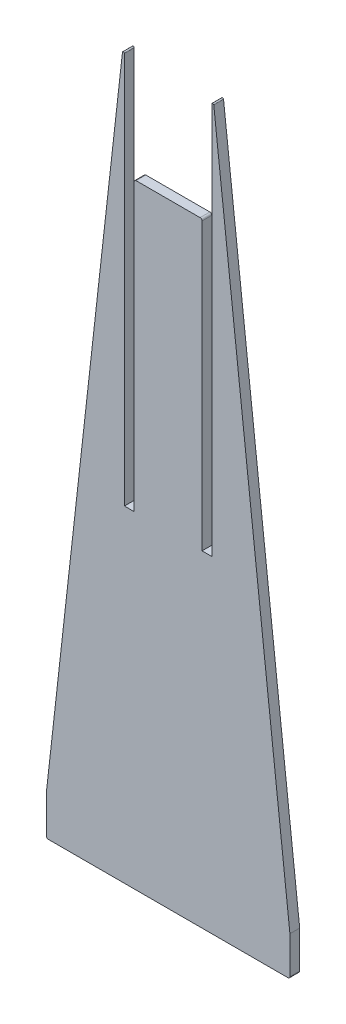
ISO-10303-21;
HEADER;
FILE_DESCRIPTION(('STEP AP214'),'2;1');
FILE_NAME('part.step','',(''),(''),'','','');
FILE_SCHEMA(('AUTOMOTIVE_DESIGN { 1 0 10303 214 1 1 1 1 }'));
ENDSEC;
DATA;
#1=APPLICATION_CONTEXT('core data for automotive mechanical design processes');
#2=APPLICATION_PROTOCOL_DEFINITION('international standard','automotive_design',2000,#1);
#3=PRODUCT_CONTEXT('',#1,'mechanical');
#4=PRODUCT('Part','Part','',(#3));
#5=PRODUCT_RELATED_PRODUCT_CATEGORY('part','',(#4));
#6=PRODUCT_DEFINITION_FORMATION('','',#4);
#7=PRODUCT_DEFINITION_CONTEXT('part definition',#1,'design');
#8=PRODUCT_DEFINITION('design','',#6,#7);
#9=PRODUCT_DEFINITION_SHAPE('','',#8);
#10=(LENGTH_UNIT() NAMED_UNIT(*) SI_UNIT(.MILLI.,.METRE.));
#11=(NAMED_UNIT(*) PLANE_ANGLE_UNIT() SI_UNIT($,.RADIAN.));
#12=(NAMED_UNIT(*) SI_UNIT($,.STERADIAN.) SOLID_ANGLE_UNIT());
#13=UNCERTAINTY_MEASURE_WITH_UNIT(LENGTH_MEASURE(1.E-05),#10,'distance_accuracy_value','');
#14=(GEOMETRIC_REPRESENTATION_CONTEXT(3) GLOBAL_UNCERTAINTY_ASSIGNED_CONTEXT((#13)) GLOBAL_UNIT_ASSIGNED_CONTEXT((#10,
#11,#12)) REPRESENTATION_CONTEXT('',''));
#15=CARTESIAN_POINT('',(0.,0.,0.));
#16=DIRECTION('',(0.,0.,1.));
#17=DIRECTION('',(1.,0.,0.));
#18=AXIS2_PLACEMENT_3D('',#15,#16,#17);
#19=CARTESIAN_POINT('',(-22.35,376.5,2.5));
#20=DIRECTION('',(-1.,0.,0.));
#21=DIRECTION('',(0.,-1.,0.));
#22=AXIS2_PLACEMENT_3D('',#19,#20,#21);
#23=PLANE('',#22);
#24=DIRECTION('',(0.,1.,0.));
#25=VECTOR('',#24,1.);
#26=CARTESIAN_POINT('',(-22.35,376.5,-2.5));
#27=LINE('',#26,#25);
#28=CARTESIAN_POINT('',(-22.35,167.1,-2.5));
#29=VERTEX_POINT('',#28);
#30=CARTESIAN_POINT('',(-22.35,367.54841740929,-2.5));
#31=VERTEX_POINT('',#30);
#32=EDGE_CURVE('E210',#29,#31,#27,.T.);
#33=ORIENTED_EDGE('',*,*,#32,.T.);
#34=DIRECTION('',(0.,0.,-1.));
#35=VECTOR('',#34,1.);
#36=CARTESIAN_POINT('',(-22.35,367.54841740929,2.5));
#37=LINE('',#36,#35);
#38=CARTESIAN_POINT('',(-22.35,367.54841740929,2.5));
#39=VERTEX_POINT('',#38);
#40=EDGE_CURVE('E290',#31,#39,#37,.F.);
#41=ORIENTED_EDGE('',*,*,#40,.T.);
#42=DIRECTION('',(0.,1.,0.));
#43=VECTOR('',#42,1.);
#44=CARTESIAN_POINT('',(-22.35,376.5,2.5));
#45=LINE('',#44,#43);
#46=CARTESIAN_POINT('',(-22.35,167.1,2.5));
#47=VERTEX_POINT('',#46);
#48=EDGE_CURVE('E169',#47,#39,#45,.T.);
#49=ORIENTED_EDGE('',*,*,#48,.F.);
#50=DIRECTION('',(0.,0.,-1.));
#51=VECTOR('',#50,1.);
#52=CARTESIAN_POINT('',(-22.35,167.1,2.5));
#53=LINE('',#52,#51);
#54=EDGE_CURVE('E209',#47,#29,#53,.T.);
#55=ORIENTED_EDGE('',*,*,#54,.T.);
#56=EDGE_LOOP('',(#33,#41,#49,#55));
#57=FACE_BOUND('',#56,.T.);
#58=ADVANCED_FACE('F33',(#57),#23,.F.);
#59=CARTESIAN_POINT('',(-22.35,376.5,2.5));
#60=DIRECTION('',(0.993779611450434,-0.111364643695497,0.));
#61=DIRECTION('',(0.111364643695497,0.993779611450434,0.));
#62=AXIS2_PLACEMENT_3D('',#59,#60,#61);
#63=PLANE('',#62);
#64=DIRECTION('',(-0.111364643695497,-0.993779611450434,0.));
#65=VECTOR('',#64,1.);
#66=CARTESIAN_POINT('',(-22.35,376.5,2.5));
#67=LINE('',#66,#65);
#68=CARTESIAN_POINT('',(-23.3468898057252,367.604099731138,2.5));
#69=VERTEX_POINT('',#68);
#70=CARTESIAN_POINT('',(-62.3,20.,2.5));
#71=VERTEX_POINT('',#70);
#72=EDGE_CURVE('E157',#69,#71,#67,.T.);
#73=ORIENTED_EDGE('',*,*,#72,.F.);
#74=DIRECTION('',(0.,0.,-1.));
#75=VECTOR('',#74,1.);
#76=CARTESIAN_POINT('',(-23.3468898057252,367.604099731138,2.5));
#77=LINE('',#76,#75);
#78=CARTESIAN_POINT('',(-23.3468898057252,367.604099731138,-2.5));
#79=VERTEX_POINT('',#78);
#80=EDGE_CURVE('E284',#69,#79,#77,.T.);
#81=ORIENTED_EDGE('',*,*,#80,.T.);
#82=DIRECTION('',(-0.111364643695497,-0.993779611450434,0.));
#83=VECTOR('',#82,1.);
#84=CARTESIAN_POINT('',(-22.35,376.5,-2.5));
#85=LINE('',#84,#83);
#86=CARTESIAN_POINT('',(-62.3,20.,-2.5));
#87=VERTEX_POINT('',#86);
#88=EDGE_CURVE('E175',#79,#87,#85,.T.);
#89=ORIENTED_EDGE('',*,*,#88,.T.);
#90=DIRECTION('',(0.,0.,-1.));
#91=VECTOR('',#90,1.);
#92=CARTESIAN_POINT('',(-62.3,20.,2.5));
#93=LINE('',#92,#91);
#94=EDGE_CURVE('E172',#71,#87,#93,.T.);
#95=ORIENTED_EDGE('',*,*,#94,.F.);
#96=EDGE_LOOP('',(#73,#81,#89,#95));
#97=FACE_BOUND('',#96,.T.);
#98=ADVANCED_FACE('F173',(#97),#63,.F.);
#99=CARTESIAN_POINT('',(-62.3,20.,2.5));
#100=DIRECTION('',(1.,0.,0.));
#101=DIRECTION('',(0.,0.,-1.));
#102=AXIS2_PLACEMENT_3D('',#99,#100,#101);
#103=PLANE('',#102);
#104=DIRECTION('',(0.,-1.,0.));
#105=VECTOR('',#104,1.);
#106=CARTESIAN_POINT('',(-62.3,20.,-2.5));
#107=LINE('',#106,#105);
#108=CARTESIAN_POINT('',(-62.3,0.999999999999984,-2.5));
#109=VERTEX_POINT('',#108);
#110=EDGE_CURVE('E214',#87,#109,#107,.T.);
#111=ORIENTED_EDGE('',*,*,#110,.T.);
#112=DIRECTION('',(0.,0.,-1.));
#113=VECTOR('',#112,1.);
#114=CARTESIAN_POINT('',(-62.3,0.999999999999984,2.5));
#115=LINE('',#114,#113);
#116=CARTESIAN_POINT('',(-62.3,0.999999999999984,2.5));
#117=VERTEX_POINT('',#116);
#118=EDGE_CURVE('E184',#109,#117,#115,.F.);
#119=ORIENTED_EDGE('',*,*,#118,.T.);
#120=DIRECTION('',(0.,-1.,0.));
#121=VECTOR('',#120,1.);
#122=CARTESIAN_POINT('',(-62.3,20.,2.5));
#123=LINE('',#122,#121);
#124=EDGE_CURVE('E162',#71,#117,#123,.T.);
#125=ORIENTED_EDGE('',*,*,#124,.F.);
#126=ORIENTED_EDGE('',*,*,#94,.T.);
#127=EDGE_LOOP('',(#111,#119,#125,#126));
#128=FACE_BOUND('',#127,.T.);
#129=ADVANCED_FACE('F182',(#128),#103,.F.);
#130=CARTESIAN_POINT('',(-62.3,0.,2.5));
#131=DIRECTION('',(0.,1.,0.));
#132=DIRECTION('',(-1.,0.,0.));
#133=AXIS2_PLACEMENT_3D('',#130,#131,#132);
#134=PLANE('',#133);
#135=DIRECTION('',(1.,0.,0.));
#136=VECTOR('',#135,1.);
#137=CARTESIAN_POINT('',(-62.3,0.,2.5));
#138=LINE('',#137,#136);
#139=CARTESIAN_POINT('',(-61.3,0.,2.5));
#140=VERTEX_POINT('',#139);
#141=CARTESIAN_POINT('',(61.3000000000001,0.,2.5));
#142=VERTEX_POINT('',#141);
#143=EDGE_CURVE('E185',#140,#142,#138,.T.);
#144=ORIENTED_EDGE('',*,*,#143,.F.);
#145=DIRECTION('',(0.,0.,-1.));
#146=VECTOR('',#145,1.);
#147=CARTESIAN_POINT('',(-61.3,0.,2.5));
#148=LINE('',#147,#146);
#149=CARTESIAN_POINT('',(-61.3,0.,-2.5));
#150=VERTEX_POINT('',#149);
#151=EDGE_CURVE('E251',#140,#150,#148,.T.);
#152=ORIENTED_EDGE('',*,*,#151,.T.);
#153=DIRECTION('',(1.,0.,0.));
#154=VECTOR('',#153,1.);
#155=CARTESIAN_POINT('',(-62.3,0.,-2.5));
#156=LINE('',#155,#154);
#157=CARTESIAN_POINT('',(61.3000000000001,0.,-2.5));
#158=VERTEX_POINT('',#157);
#159=EDGE_CURVE('E216',#150,#158,#156,.T.);
#160=ORIENTED_EDGE('',*,*,#159,.T.);
#161=DIRECTION('',(0.,0.,-1.));
#162=VECTOR('',#161,1.);
#163=CARTESIAN_POINT('',(61.3000000000001,0.,2.5));
#164=LINE('',#163,#162);
#165=EDGE_CURVE('E179',#158,#142,#164,.F.);
#166=ORIENTED_EDGE('',*,*,#165,.T.);
#167=EDGE_LOOP('',(#144,#152,#160,#166));
#168=FACE_BOUND('',#167,.T.);
#169=ADVANCED_FACE('F349',(#168),#134,.F.);
#170=CARTESIAN_POINT('',(62.3000000000001,20.,2.5));
#171=DIRECTION('',(-1.,0.,0.));
#172=DIRECTION('',(0.,-1.,0.));
#173=AXIS2_PLACEMENT_3D('',#170,#171,#172);
#174=PLANE('',#173);
#175=DIRECTION('',(0.,1.,0.));
#176=VECTOR('',#175,1.);
#177=CARTESIAN_POINT('',(62.3000000000001,20.,2.5));
#178=LINE('',#177,#176);
#179=CARTESIAN_POINT('',(62.3000000000001,0.999999999999997,2.5));
#180=VERTEX_POINT('',#179);
#181=CARTESIAN_POINT('',(62.3000000000001,20.,2.5));
#182=VERTEX_POINT('',#181);
#183=EDGE_CURVE('E188',#180,#182,#178,.T.);
#184=ORIENTED_EDGE('',*,*,#183,.F.);
#185=DIRECTION('',(0.,0.,-1.));
#186=VECTOR('',#185,1.);
#187=CARTESIAN_POINT('',(62.3000000000001,0.999999999999997,2.5));
#188=LINE('',#187,#186);
#189=CARTESIAN_POINT('',(62.3000000000001,0.999999999999997,-2.5));
#190=VERTEX_POINT('',#189);
#191=EDGE_CURVE('E271',#180,#190,#188,.T.);
#192=ORIENTED_EDGE('',*,*,#191,.T.);
#193=DIRECTION('',(0.,1.,0.));
#194=VECTOR('',#193,1.);
#195=CARTESIAN_POINT('',(62.3000000000001,20.,-2.5));
#196=LINE('',#195,#194);
#197=CARTESIAN_POINT('',(62.3000000000001,20.,-2.5));
#198=VERTEX_POINT('',#197);
#199=EDGE_CURVE('E219',#190,#198,#196,.T.);
#200=ORIENTED_EDGE('',*,*,#199,.T.);
#201=DIRECTION('',(0.,0.,-1.));
#202=VECTOR('',#201,1.);
#203=CARTESIAN_POINT('',(62.3000000000001,20.,2.5));
#204=LINE('',#203,#202);
#205=EDGE_CURVE('E180',#182,#198,#204,.T.);
#206=ORIENTED_EDGE('',*,*,#205,.F.);
#207=EDGE_LOOP('',(#184,#192,#200,#206));
#208=FACE_BOUND('',#207,.T.);
#209=ADVANCED_FACE('F357',(#208),#174,.F.);
#210=CARTESIAN_POINT('',(22.35,376.5,2.5));
#211=DIRECTION('',(-0.993779611450434,-0.111364643695498,0.));
#212=DIRECTION('',(0.111364643695498,-0.993779611450434,0.));
#213=AXIS2_PLACEMENT_3D('',#210,#211,#212);
#214=PLANE('',#213);
#215=DIRECTION('',(-0.111364643695498,0.993779611450434,0.));
#216=VECTOR('',#215,1.);
#217=CARTESIAN_POINT('',(22.35,376.5,-2.5));
#218=LINE('',#217,#216);
#219=CARTESIAN_POINT('',(23.3468898057252,367.604099731138,-2.5));
#220=VERTEX_POINT('',#219);
#221=EDGE_CURVE('E221',#198,#220,#218,.T.);
#222=ORIENTED_EDGE('',*,*,#221,.T.);
#223=DIRECTION('',(0.,0.,-1.));
#224=VECTOR('',#223,1.);
#225=CARTESIAN_POINT('',(23.3468898057252,367.604099731138,2.5));
#226=LINE('',#225,#224);
#227=CARTESIAN_POINT('',(23.3468898057252,367.604099731138,2.5));
#228=VERTEX_POINT('',#227);
#229=EDGE_CURVE('E11',#220,#228,#226,.F.);
#230=ORIENTED_EDGE('',*,*,#229,.T.);
#231=DIRECTION('',(-0.111364643695498,0.993779611450434,0.));
#232=VECTOR('',#231,1.);
#233=CARTESIAN_POINT('',(22.35,376.5,2.5));
#234=LINE('',#233,#232);
#235=EDGE_CURVE('E193',#182,#228,#234,.T.);
#236=ORIENTED_EDGE('',*,*,#235,.F.);
#237=ORIENTED_EDGE('',*,*,#205,.T.);
#238=EDGE_LOOP('',(#222,#230,#236,#237));
#239=FACE_BOUND('',#238,.T.);
#240=ADVANCED_FACE('F359',(#239),#214,.F.);
#241=CARTESIAN_POINT('',(22.35,376.5,2.5));
#242=DIRECTION('',(1.,0.,0.));
#243=DIRECTION('',(0.,1.,0.));
#244=AXIS2_PLACEMENT_3D('',#241,#242,#243);
#245=PLANE('',#244);
#246=DIRECTION('',(0.,-1.,0.));
#247=VECTOR('',#246,1.);
#248=CARTESIAN_POINT('',(22.35,376.5,2.5));
#249=LINE('',#248,#247);
#250=CARTESIAN_POINT('',(22.35,367.54841740929,2.5));
#251=VERTEX_POINT('',#250);
#252=CARTESIAN_POINT('',(22.35,167.1,2.5));
#253=VERTEX_POINT('',#252);
#254=EDGE_CURVE('E195',#251,#253,#249,.T.);
#255=ORIENTED_EDGE('',*,*,#254,.F.);
#256=DIRECTION('',(0.,0.,-1.));
#257=VECTOR('',#256,1.);
#258=CARTESIAN_POINT('',(22.35,367.54841740929,2.5));
#259=LINE('',#258,#257);
#260=CARTESIAN_POINT('',(22.35,367.54841740929,-2.5));
#261=VERTEX_POINT('',#260);
#262=EDGE_CURVE('E41',#251,#261,#259,.T.);
#263=ORIENTED_EDGE('',*,*,#262,.T.);
#264=DIRECTION('',(0.,-1.,0.));
#265=VECTOR('',#264,1.);
#266=CARTESIAN_POINT('',(22.35,376.5,-2.5));
#267=LINE('',#266,#265);
#268=CARTESIAN_POINT('',(22.35,167.1,-2.5));
#269=VERTEX_POINT('',#268);
#270=EDGE_CURVE('E223',#261,#269,#267,.T.);
#271=ORIENTED_EDGE('',*,*,#270,.T.);
#272=DIRECTION('',(0.,0.,-1.));
#273=VECTOR('',#272,1.);
#274=CARTESIAN_POINT('',(22.35,167.1,2.5));
#275=LINE('',#274,#273);
#276=EDGE_CURVE('E245',#253,#269,#275,.T.);
#277=ORIENTED_EDGE('',*,*,#276,.F.);
#278=EDGE_LOOP('',(#255,#263,#271,#277));
#279=FACE_BOUND('',#278,.T.);
#280=ADVANCED_FACE('F297',(#279),#245,.F.);
#281=CARTESIAN_POINT('',(22.35,167.1,2.5));
#282=DIRECTION('',(0.,-1.,0.));
#283=DIRECTION('',(0.,0.,-1.));
#284=AXIS2_PLACEMENT_3D('',#281,#282,#283);
#285=PLANE('',#284);
#286=DIRECTION('',(-1.,0.,0.));
#287=VECTOR('',#286,1.);
#288=CARTESIAN_POINT('',(22.35,167.1,-2.5));
#289=LINE('',#288,#287);
#290=CARTESIAN_POINT('',(17.35,167.1,-2.5));
#291=VERTEX_POINT('',#290);
#292=EDGE_CURVE('E225',#269,#291,#289,.T.);
#293=ORIENTED_EDGE('',*,*,#292,.T.);
#294=DIRECTION('',(0.,0.,-1.));
#295=VECTOR('',#294,1.);
#296=CARTESIAN_POINT('',(17.35,167.1,2.5));
#297=LINE('',#296,#295);
#298=CARTESIAN_POINT('',(17.35,167.1,2.5));
#299=VERTEX_POINT('',#298);
#300=EDGE_CURVE('E242',#299,#291,#297,.T.);
#301=ORIENTED_EDGE('',*,*,#300,.F.);
#302=DIRECTION('',(-1.,0.,0.));
#303=VECTOR('',#302,1.);
#304=CARTESIAN_POINT('',(22.35,167.1,2.5));
#305=LINE('',#304,#303);
#306=EDGE_CURVE('E197',#253,#299,#305,.T.);
#307=ORIENTED_EDGE('',*,*,#306,.F.);
#308=ORIENTED_EDGE('',*,*,#276,.T.);
#309=EDGE_LOOP('',(#293,#301,#307,#308));
#310=FACE_BOUND('',#309,.T.);
#311=ADVANCED_FACE('F307',(#310),#285,.F.);
#312=CARTESIAN_POINT('',(17.35,314.2,2.5));
#313=DIRECTION('',(-1.,0.,0.));
#314=DIRECTION('',(0.,-1.,0.));
#315=AXIS2_PLACEMENT_3D('',#312,#313,#314);
#316=PLANE('',#315);
#317=DIRECTION('',(0.,1.,0.));
#318=VECTOR('',#317,1.);
#319=CARTESIAN_POINT('',(17.35,314.2,-2.5));
#320=LINE('',#319,#318);
#321=CARTESIAN_POINT('',(17.35,313.2,-2.5));
#322=VERTEX_POINT('',#321);
#323=EDGE_CURVE('E227',#291,#322,#320,.T.);
#324=ORIENTED_EDGE('',*,*,#323,.T.);
#325=DIRECTION('',(0.,0.,-1.));
#326=VECTOR('',#325,1.);
#327=CARTESIAN_POINT('',(17.35,313.2,2.5));
#328=LINE('',#327,#326);
#329=CARTESIAN_POINT('',(17.35,313.2,2.5));
#330=VERTEX_POINT('',#329);
#331=EDGE_CURVE('E279',#322,#330,#328,.F.);
#332=ORIENTED_EDGE('',*,*,#331,.T.);
#333=DIRECTION('',(0.,1.,0.));
#334=VECTOR('',#333,1.);
#335=CARTESIAN_POINT('',(17.35,314.2,2.5));
#336=LINE('',#335,#334);
#337=EDGE_CURVE('E199',#299,#330,#336,.T.);
#338=ORIENTED_EDGE('',*,*,#337,.F.);
#339=ORIENTED_EDGE('',*,*,#300,.T.);
#340=EDGE_LOOP('',(#324,#332,#338,#339));
#341=FACE_BOUND('',#340,.T.);
#342=ADVANCED_FACE('F311',(#341),#316,.F.);
#343=CARTESIAN_POINT('',(-17.35,314.2,2.5));
#344=DIRECTION('',(0.,-1.,0.));
#345=DIRECTION('',(0.,0.,-1.));
#346=AXIS2_PLACEMENT_3D('',#343,#344,#345);
#347=PLANE('',#346);
#348=DIRECTION('',(-1.,0.,0.));
#349=VECTOR('',#348,1.);
#350=CARTESIAN_POINT('',(-17.35,314.2,2.5));
#351=LINE('',#350,#349);
#352=CARTESIAN_POINT('',(16.35,314.2,2.5));
#353=VERTEX_POINT('',#352);
#354=CARTESIAN_POINT('',(-16.35,314.2,2.5));
#355=VERTEX_POINT('',#354);
#356=EDGE_CURVE('E202',#353,#355,#351,.T.);
#357=ORIENTED_EDGE('',*,*,#356,.F.);
#358=DIRECTION('',(0.,0.,-1.));
#359=VECTOR('',#358,1.);
#360=CARTESIAN_POINT('',(16.35,314.2,2.5));
#361=LINE('',#360,#359);
#362=CARTESIAN_POINT('',(16.35,314.2,-2.5));
#363=VERTEX_POINT('',#362);
#364=EDGE_CURVE('E276',#353,#363,#361,.T.);
#365=ORIENTED_EDGE('',*,*,#364,.T.);
#366=DIRECTION('',(-1.,0.,0.));
#367=VECTOR('',#366,1.);
#368=CARTESIAN_POINT('',(-17.35,314.2,-2.5));
#369=LINE('',#368,#367);
#370=CARTESIAN_POINT('',(-16.35,314.2,-2.5));
#371=VERTEX_POINT('',#370);
#372=EDGE_CURVE('E230',#363,#371,#369,.T.);
#373=ORIENTED_EDGE('',*,*,#372,.T.);
#374=DIRECTION('',(0.,0.,-1.));
#375=VECTOR('',#374,1.);
#376=CARTESIAN_POINT('',(-16.35,314.2,2.5));
#377=LINE('',#376,#375);
#378=EDGE_CURVE('E274',#371,#355,#377,.F.);
#379=ORIENTED_EDGE('',*,*,#378,.T.);
#380=EDGE_LOOP('',(#357,#365,#373,#379));
#381=FACE_BOUND('',#380,.T.);
#382=ADVANCED_FACE('F320',(#381),#347,.F.);
#383=CARTESIAN_POINT('',(-17.35,314.2,2.5));
#384=DIRECTION('',(1.,0.,0.));
#385=DIRECTION('',(0.,0.,-1.));
#386=AXIS2_PLACEMENT_3D('',#383,#384,#385);
#387=PLANE('',#386);
#388=DIRECTION('',(0.,-1.,0.));
#389=VECTOR('',#388,1.);
#390=CARTESIAN_POINT('',(-17.35,314.2,2.5));
#391=LINE('',#390,#389);
#392=CARTESIAN_POINT('',(-17.35,313.2,2.5));
#393=VERTEX_POINT('',#392);
#394=CARTESIAN_POINT('',(-17.35,167.1,2.5));
#395=VERTEX_POINT('',#394);
#396=EDGE_CURVE('E205',#393,#395,#391,.T.);
#397=ORIENTED_EDGE('',*,*,#396,.F.);
#398=DIRECTION('',(0.,0.,-1.));
#399=VECTOR('',#398,1.);
#400=CARTESIAN_POINT('',(-17.35,313.2,2.5));
#401=LINE('',#400,#399);
#402=CARTESIAN_POINT('',(-17.35,313.2,-2.5));
#403=VERTEX_POINT('',#402);
#404=EDGE_CURVE('E281',#393,#403,#401,.T.);
#405=ORIENTED_EDGE('',*,*,#404,.T.);
#406=DIRECTION('',(0.,-1.,0.));
#407=VECTOR('',#406,1.);
#408=CARTESIAN_POINT('',(-17.35,314.2,-2.5));
#409=LINE('',#408,#407);
#410=CARTESIAN_POINT('',(-17.35,167.1,-2.5));
#411=VERTEX_POINT('',#410);
#412=EDGE_CURVE('E233',#403,#411,#409,.T.);
#413=ORIENTED_EDGE('',*,*,#412,.T.);
#414=DIRECTION('',(0.,0.,-1.));
#415=VECTOR('',#414,1.);
#416=CARTESIAN_POINT('',(-17.35,167.1,2.5));
#417=LINE('',#416,#415);
#418=EDGE_CURVE('E239',#395,#411,#417,.T.);
#419=ORIENTED_EDGE('',*,*,#418,.F.);
#420=EDGE_LOOP('',(#397,#405,#413,#419));
#421=FACE_BOUND('',#420,.T.);
#422=ADVANCED_FACE('F330',(#421),#387,.F.);
#423=CARTESIAN_POINT('',(-22.35,167.1,2.5));
#424=DIRECTION('',(0.,-1.,0.));
#425=DIRECTION('',(0.,0.,-1.));
#426=AXIS2_PLACEMENT_3D('',#423,#424,#425);
#427=PLANE('',#426);
#428=DIRECTION('',(-1.,0.,0.));
#429=VECTOR('',#428,1.);
#430=CARTESIAN_POINT('',(-22.35,167.1,-2.5));
#431=LINE('',#430,#429);
#432=EDGE_CURVE('E235',#411,#29,#431,.T.);
#433=ORIENTED_EDGE('',*,*,#432,.T.);
#434=ORIENTED_EDGE('',*,*,#54,.F.);
#435=DIRECTION('',(-1.,0.,0.));
#436=VECTOR('',#435,1.);
#437=CARTESIAN_POINT('',(-22.35,167.1,2.5));
#438=LINE('',#437,#436);
#439=EDGE_CURVE('E207',#395,#47,#438,.T.);
#440=ORIENTED_EDGE('',*,*,#439,.F.);
#441=ORIENTED_EDGE('',*,*,#418,.T.);
#442=EDGE_LOOP('',(#433,#434,#440,#441));
#443=FACE_BOUND('',#442,.T.);
#444=ADVANCED_FACE('F336',(#443),#427,.F.);
#445=CARTESIAN_POINT('',(0.,0.,2.5));
#446=DIRECTION('',(0.,0.,1.));
#447=DIRECTION('',(1.,0.,0.));
#448=AXIS2_PLACEMENT_3D('',#445,#446,#447);
#449=PLANE('',#448);
#450=ORIENTED_EDGE('',*,*,#48,.T.);
#451=CARTESIAN_POINT('',(-22.85,367.54841740929,2.5));
#452=DIRECTION('',(0.,0.,1.));
#453=DIRECTION('',(1.,0.,0.));
#454=AXIS2_PLACEMENT_3D('',#451,#452,#453);
#455=CIRCLE('',#454,0.5);
#456=EDGE_CURVE('E165',#39,#69,#455,.T.);
#457=ORIENTED_EDGE('',*,*,#456,.T.);
#458=ORIENTED_EDGE('',*,*,#72,.T.);
#459=ORIENTED_EDGE('',*,*,#124,.T.);
#460=CARTESIAN_POINT('',(-61.3,0.999999999999985,2.5));
#461=DIRECTION('',(0.,0.,1.));
#462=DIRECTION('',(1.,0.,0.));
#463=AXIS2_PLACEMENT_3D('',#460,#461,#462);
#464=CIRCLE('',#463,1.);
#465=EDGE_CURVE('E269',#117,#140,#464,.T.);
#466=ORIENTED_EDGE('',*,*,#465,.T.);
#467=ORIENTED_EDGE('',*,*,#143,.T.);
#468=CARTESIAN_POINT('',(61.3000000000001,0.999999999999997,2.5));
#469=DIRECTION('',(0.,0.,1.));
#470=DIRECTION('',(1.,0.,0.));
#471=AXIS2_PLACEMENT_3D('',#468,#469,#470);
#472=CIRCLE('',#471,1.);
#473=EDGE_CURVE('E267',#142,#180,#472,.T.);
#474=ORIENTED_EDGE('',*,*,#473,.T.);
#475=ORIENTED_EDGE('',*,*,#183,.T.);
#476=ORIENTED_EDGE('',*,*,#235,.T.);
#477=CARTESIAN_POINT('',(22.85,367.54841740929,2.5));
#478=DIRECTION('',(0.,0.,1.));
#479=DIRECTION('',(1.,0.,0.));
#480=AXIS2_PLACEMENT_3D('',#477,#478,#479);
#481=CIRCLE('',#480,0.5);
#482=EDGE_CURVE('E48',#228,#251,#481,.T.);
#483=ORIENTED_EDGE('',*,*,#482,.T.);
#484=ORIENTED_EDGE('',*,*,#254,.T.);
#485=ORIENTED_EDGE('',*,*,#306,.T.);
#486=ORIENTED_EDGE('',*,*,#337,.T.);
#487=CARTESIAN_POINT('',(16.35,313.2,2.5));
#488=DIRECTION('',(0.,0.,1.));
#489=DIRECTION('',(1.,0.,0.));
#490=AXIS2_PLACEMENT_3D('',#487,#488,#489);
#491=CIRCLE('',#490,1.);
#492=EDGE_CURVE('E265',#330,#353,#491,.T.);
#493=ORIENTED_EDGE('',*,*,#492,.T.);
#494=ORIENTED_EDGE('',*,*,#356,.T.);
#495=CARTESIAN_POINT('',(-16.35,313.2,2.5));
#496=DIRECTION('',(0.,0.,1.));
#497=DIRECTION('',(1.,0.,0.));
#498=AXIS2_PLACEMENT_3D('',#495,#496,#497);
#499=CIRCLE('',#498,1.);
#500=EDGE_CURVE('E263',#355,#393,#499,.T.);
#501=ORIENTED_EDGE('',*,*,#500,.T.);
#502=ORIENTED_EDGE('',*,*,#396,.T.);
#503=ORIENTED_EDGE('',*,*,#439,.T.);
#504=EDGE_LOOP('',(#450,#457,#458,#459,#466,#467,#474,#475,#476,#483,#484,#485,#486,#493,#494,
#501,#502,#503));
#505=FACE_BOUND('',#504,.T.);
#506=ADVANCED_FACE('F160',(#505),#449,.T.);
#507=CARTESIAN_POINT('',(0.,0.,-2.5));
#508=DIRECTION('',(0.,0.,1.));
#509=DIRECTION('',(1.,0.,0.));
#510=AXIS2_PLACEMENT_3D('',#507,#508,#509);
#511=PLANE('',#510);
#512=ORIENTED_EDGE('',*,*,#88,.F.);
#513=CARTESIAN_POINT('',(-22.85,367.54841740929,-2.5));
#514=DIRECTION('',(0.,0.,1.));
#515=DIRECTION('',(1.,0.,0.));
#516=AXIS2_PLACEMENT_3D('',#513,#514,#515);
#517=CIRCLE('',#516,0.5);
#518=EDGE_CURVE('E288',#79,#31,#517,.F.);
#519=ORIENTED_EDGE('',*,*,#518,.T.);
#520=ORIENTED_EDGE('',*,*,#32,.F.);
#521=ORIENTED_EDGE('',*,*,#432,.F.);
#522=ORIENTED_EDGE('',*,*,#412,.F.);
#523=CARTESIAN_POINT('',(-16.35,313.2,-2.5));
#524=DIRECTION('',(0.,0.,1.));
#525=DIRECTION('',(1.,0.,0.));
#526=AXIS2_PLACEMENT_3D('',#523,#524,#525);
#527=CIRCLE('',#526,1.);
#528=EDGE_CURVE('E254',#403,#371,#527,.F.);
#529=ORIENTED_EDGE('',*,*,#528,.T.);
#530=ORIENTED_EDGE('',*,*,#372,.F.);
#531=CARTESIAN_POINT('',(16.35,313.2,-2.5));
#532=DIRECTION('',(0.,0.,1.));
#533=DIRECTION('',(1.,0.,0.));
#534=AXIS2_PLACEMENT_3D('',#531,#532,#533);
#535=CIRCLE('',#534,1.);
#536=EDGE_CURVE('E256',#363,#322,#535,.F.);
#537=ORIENTED_EDGE('',*,*,#536,.T.);
#538=ORIENTED_EDGE('',*,*,#323,.F.);
#539=ORIENTED_EDGE('',*,*,#292,.F.);
#540=ORIENTED_EDGE('',*,*,#270,.F.);
#541=CARTESIAN_POINT('',(22.85,367.54841740929,-2.5));
#542=DIRECTION('',(0.,0.,1.));
#543=DIRECTION('',(1.,0.,0.));
#544=AXIS2_PLACEMENT_3D('',#541,#542,#543);
#545=CIRCLE('',#544,0.5);
#546=EDGE_CURVE('E286',#261,#220,#545,.F.);
#547=ORIENTED_EDGE('',*,*,#546,.T.);
#548=ORIENTED_EDGE('',*,*,#221,.F.);
#549=ORIENTED_EDGE('',*,*,#199,.F.);
#550=CARTESIAN_POINT('',(61.3000000000001,0.999999999999997,-2.5));
#551=DIRECTION('',(0.,0.,1.));
#552=DIRECTION('',(1.,0.,0.));
#553=AXIS2_PLACEMENT_3D('',#550,#551,#552);
#554=CIRCLE('',#553,1.);
#555=EDGE_CURVE('E258',#190,#158,#554,.F.);
#556=ORIENTED_EDGE('',*,*,#555,.T.);
#557=ORIENTED_EDGE('',*,*,#159,.F.);
#558=CARTESIAN_POINT('',(-61.3,0.999999999999985,-2.5));
#559=DIRECTION('',(0.,0.,1.));
#560=DIRECTION('',(1.,0.,0.));
#561=AXIS2_PLACEMENT_3D('',#558,#559,#560);
#562=CIRCLE('',#561,1.);
#563=EDGE_CURVE('E260',#150,#109,#562,.F.);
#564=ORIENTED_EDGE('',*,*,#563,.T.);
#565=ORIENTED_EDGE('',*,*,#110,.F.);
#566=EDGE_LOOP('',(#512,#519,#520,#521,#522,#529,#530,#537,#538,#539,#540,#547,#548,#549,#556,
#557,#564,#565));
#567=FACE_BOUND('',#566,.T.);
#568=ADVANCED_FACE('F302',(#567),#511,.F.);
#569=CARTESIAN_POINT('',(-61.3,0.999999999999985,2.5));
#570=DIRECTION('',(0.,0.,-1.));
#571=DIRECTION('',(-1.,0.,0.));
#572=AXIS2_PLACEMENT_3D('',#569,#570,#571);
#573=CYLINDRICAL_SURFACE('',#572,1.);
#574=ORIENTED_EDGE('',*,*,#465,.F.);
#575=ORIENTED_EDGE('',*,*,#118,.F.);
#576=ORIENTED_EDGE('',*,*,#563,.F.);
#577=ORIENTED_EDGE('',*,*,#151,.F.);
#578=EDGE_LOOP('',(#574,#575,#576,#577));
#579=FACE_BOUND('',#578,.T.);
#580=ADVANCED_FACE('F344',(#579),#573,.T.);
#581=CARTESIAN_POINT('',(61.3000000000001,0.999999999999997,2.5));
#582=DIRECTION('',(0.,0.,-1.));
#583=DIRECTION('',(-1.,0.,0.));
#584=AXIS2_PLACEMENT_3D('',#581,#582,#583);
#585=CYLINDRICAL_SURFACE('',#584,1.);
#586=ORIENTED_EDGE('',*,*,#473,.F.);
#587=ORIENTED_EDGE('',*,*,#165,.F.);
#588=ORIENTED_EDGE('',*,*,#555,.F.);
#589=ORIENTED_EDGE('',*,*,#191,.F.);
#590=EDGE_LOOP('',(#586,#587,#588,#589));
#591=FACE_BOUND('',#590,.T.);
#592=ADVANCED_FACE('F352',(#591),#585,.T.);
#593=CARTESIAN_POINT('',(16.35,313.2,2.5));
#594=DIRECTION('',(0.,0.,-1.));
#595=DIRECTION('',(-1.,0.,0.));
#596=AXIS2_PLACEMENT_3D('',#593,#594,#595);
#597=CYLINDRICAL_SURFACE('',#596,1.);
#598=ORIENTED_EDGE('',*,*,#492,.F.);
#599=ORIENTED_EDGE('',*,*,#331,.F.);
#600=ORIENTED_EDGE('',*,*,#536,.F.);
#601=ORIENTED_EDGE('',*,*,#364,.F.);
#602=EDGE_LOOP('',(#598,#599,#600,#601));
#603=FACE_BOUND('',#602,.T.);
#604=ADVANCED_FACE('F317',(#603),#597,.T.);
#605=CARTESIAN_POINT('',(-16.35,313.2,2.5));
#606=DIRECTION('',(0.,0.,-1.));
#607=DIRECTION('',(-1.,0.,0.));
#608=AXIS2_PLACEMENT_3D('',#605,#606,#607);
#609=CYLINDRICAL_SURFACE('',#608,1.);
#610=ORIENTED_EDGE('',*,*,#500,.F.);
#611=ORIENTED_EDGE('',*,*,#378,.F.);
#612=ORIENTED_EDGE('',*,*,#528,.F.);
#613=ORIENTED_EDGE('',*,*,#404,.F.);
#614=EDGE_LOOP('',(#610,#611,#612,#613));
#615=FACE_BOUND('',#614,.T.);
#616=ADVANCED_FACE('F327',(#615),#609,.T.);
#617=CARTESIAN_POINT('',(-22.85,367.54841740929,2.5));
#618=DIRECTION('',(0.,0.,-1.));
#619=DIRECTION('',(-1.,0.,0.));
#620=AXIS2_PLACEMENT_3D('',#617,#618,#619);
#621=CYLINDRICAL_SURFACE('',#620,0.5);
#622=ORIENTED_EDGE('',*,*,#456,.F.);
#623=ORIENTED_EDGE('',*,*,#40,.F.);
#624=ORIENTED_EDGE('',*,*,#518,.F.);
#625=ORIENTED_EDGE('',*,*,#80,.F.);
#626=EDGE_LOOP('',(#622,#623,#624,#625));
#627=FACE_BOUND('',#626,.T.);
#628=ADVANCED_FACE('F341',(#627),#621,.T.);
#629=CARTESIAN_POINT('',(22.85,367.54841740929,2.5));
#630=DIRECTION('',(0.,0.,-1.));
#631=DIRECTION('',(-1.,0.,0.));
#632=AXIS2_PLACEMENT_3D('',#629,#630,#631);
#633=CYLINDRICAL_SURFACE('',#632,0.5);
#634=ORIENTED_EDGE('',*,*,#482,.F.);
#635=ORIENTED_EDGE('',*,*,#229,.F.);
#636=ORIENTED_EDGE('',*,*,#546,.F.);
#637=ORIENTED_EDGE('',*,*,#262,.F.);
#638=EDGE_LOOP('',(#634,#635,#636,#637));
#639=FACE_BOUND('',#638,.T.);
#640=ADVANCED_FACE('F35',(#639),#633,.T.);
#641=CLOSED_SHELL('',(#58,#98,#129,#169,#209,#240,#280,#311,#342,#382,#422,#444,#506,#568,#580,
#592,#604,#616,#628,#640));
#642=MANIFOLD_SOLID_BREP('B2',#641);
#643=ADVANCED_BREP_SHAPE_REPRESENTATION('',(#18,#642),#14);
#644=SHAPE_DEFINITION_REPRESENTATION(#9,#643);
ENDSEC;
END-ISO-10303-21;
